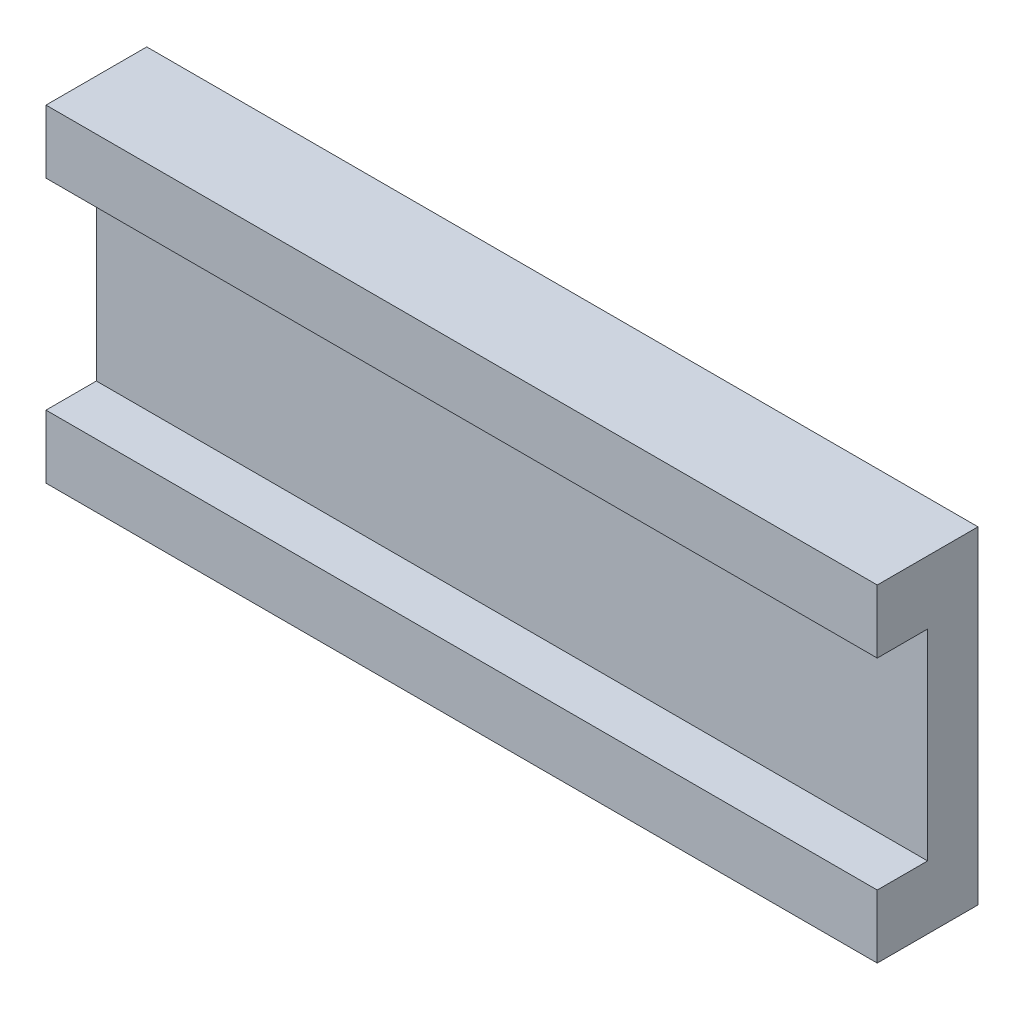
ISO-10303-21;
HEADER;
FILE_DESCRIPTION(('STEP AP214'),'2;1');
FILE_NAME('part.step','',(''),(''),'','','');
FILE_SCHEMA(('AUTOMOTIVE_DESIGN { 1 0 10303 214 1 1 1 1 }'));
ENDSEC;
DATA;
#1=APPLICATION_CONTEXT('core data for automotive mechanical design processes');
#2=APPLICATION_PROTOCOL_DEFINITION('international standard','automotive_design',2000,#1);
#3=PRODUCT_CONTEXT('',#1,'mechanical');
#4=PRODUCT('Part','Part','',(#3));
#5=PRODUCT_RELATED_PRODUCT_CATEGORY('part','',(#4));
#6=PRODUCT_DEFINITION_FORMATION('','',#4);
#7=PRODUCT_DEFINITION_CONTEXT('part definition',#1,'design');
#8=PRODUCT_DEFINITION('design','',#6,#7);
#9=PRODUCT_DEFINITION_SHAPE('','',#8);
#10=(LENGTH_UNIT() NAMED_UNIT(*) SI_UNIT(.MILLI.,.METRE.));
#11=(NAMED_UNIT(*) PLANE_ANGLE_UNIT() SI_UNIT($,.RADIAN.));
#12=(NAMED_UNIT(*) SI_UNIT($,.STERADIAN.) SOLID_ANGLE_UNIT());
#13=UNCERTAINTY_MEASURE_WITH_UNIT(LENGTH_MEASURE(1.E-05),#10,'distance_accuracy_value','');
#14=(GEOMETRIC_REPRESENTATION_CONTEXT(3) GLOBAL_UNCERTAINTY_ASSIGNED_CONTEXT((#13)) GLOBAL_UNIT_ASSIGNED_CONTEXT((#10,
#11,#12)) REPRESENTATION_CONTEXT('',''));
#15=CARTESIAN_POINT('',(0.,0.,0.));
#16=DIRECTION('',(0.,0.,1.));
#17=DIRECTION('',(1.,0.,0.));
#18=AXIS2_PLACEMENT_3D('',#15,#16,#17);
#19=CARTESIAN_POINT('',(0.,0.,5.08));
#20=DIRECTION('',(0.,0.,1.));
#21=DIRECTION('',(1.,0.,0.));
#22=AXIS2_PLACEMENT_3D('',#19,#20,#21);
#23=PLANE('',#22);
#24=DIRECTION('',(0.,-1.,0.));
#25=VECTOR('',#24,1.);
#26=CARTESIAN_POINT('',(-41.91,-16.51,5.08));
#27=LINE('',#26,#25);
#28=CARTESIAN_POINT('',(-41.91,10.1277575121056,5.08));
#29=VERTEX_POINT('',#28);
#30=CARTESIAN_POINT('',(-41.91,-10.1277575121056,5.08));
#31=VERTEX_POINT('',#30);
#32=EDGE_CURVE('E60',#29,#31,#27,.T.);
#33=ORIENTED_EDGE('',*,*,#32,.T.);
#34=DIRECTION('',(-1.,0.,0.));
#35=VECTOR('',#34,1.);
#36=CARTESIAN_POINT('',(41.91,-10.1277575121056,5.08));
#37=LINE('',#36,#35);
#38=CARTESIAN_POINT('',(41.91,-10.1277575121056,5.08));
#39=VERTEX_POINT('',#38);
#40=EDGE_CURVE('E55',#39,#31,#37,.T.);
#41=ORIENTED_EDGE('',*,*,#40,.F.);
#42=DIRECTION('',(0.,1.,0.));
#43=VECTOR('',#42,1.);
#44=CARTESIAN_POINT('',(41.91,-16.51,5.08));
#45=LINE('',#44,#43);
#46=CARTESIAN_POINT('',(41.91,10.1277575121056,5.08));
#47=VERTEX_POINT('',#46);
#48=EDGE_CURVE('E128',#39,#47,#45,.T.);
#49=ORIENTED_EDGE('',*,*,#48,.T.);
#50=DIRECTION('',(1.,0.,0.));
#51=VECTOR('',#50,1.);
#52=CARTESIAN_POINT('',(-41.91,10.1277575121056,5.08));
#53=LINE('',#52,#51);
#54=EDGE_CURVE('E130',#29,#47,#53,.T.);
#55=ORIENTED_EDGE('',*,*,#54,.F.);
#56=EDGE_LOOP('',(#33,#41,#49,#55));
#57=FACE_BOUND('',#56,.T.);
#58=ADVANCED_FACE('F39',(#57),#23,.T.);
#59=CARTESIAN_POINT('',(-41.91,-16.51,5.08));
#60=DIRECTION('',(1.,0.,0.));
#61=DIRECTION('',(0.,0.,-1.));
#62=AXIS2_PLACEMENT_3D('',#59,#60,#61);
#63=PLANE('',#62);
#64=DIRECTION('',(0.,-1.,0.));
#65=VECTOR('',#64,1.);
#66=CARTESIAN_POINT('',(-41.91,-16.51,0.));
#67=LINE('',#66,#65);
#68=CARTESIAN_POINT('',(-41.91,16.51,0.));
#69=VERTEX_POINT('',#68);
#70=CARTESIAN_POINT('',(-41.91,-16.51,0.));
#71=VERTEX_POINT('',#70);
#72=EDGE_CURVE('E161',#69,#71,#67,.T.);
#73=ORIENTED_EDGE('',*,*,#72,.T.);
#74=DIRECTION('',(0.,0.,-1.));
#75=VECTOR('',#74,1.);
#76=CARTESIAN_POINT('',(-41.91,-16.51,5.08));
#77=LINE('',#76,#75);
#78=CARTESIAN_POINT('',(-41.91,-16.51,10.16));
#79=VERTEX_POINT('',#78);
#80=EDGE_CURVE('E11',#79,#71,#77,.T.);
#81=ORIENTED_EDGE('',*,*,#80,.F.);
#82=DIRECTION('',(0.,-1.,0.));
#83=VECTOR('',#82,1.);
#84=CARTESIAN_POINT('',(-41.91,-16.51,10.16));
#85=LINE('',#84,#83);
#86=CARTESIAN_POINT('',(-41.91,-10.1277575121056,10.16));
#87=VERTEX_POINT('',#86);
#88=EDGE_CURVE('E114',#87,#79,#85,.T.);
#89=ORIENTED_EDGE('',*,*,#88,.F.);
#90=DIRECTION('',(0.,0.,-1.));
#91=VECTOR('',#90,1.);
#92=CARTESIAN_POINT('',(-41.91,-10.1277575121056,10.16));
#93=LINE('',#92,#91);
#94=EDGE_CURVE('E109',#87,#31,#93,.T.);
#95=ORIENTED_EDGE('',*,*,#94,.T.);
#96=ORIENTED_EDGE('',*,*,#32,.F.);
#97=DIRECTION('',(0.,0.,-1.));
#98=VECTOR('',#97,1.);
#99=CARTESIAN_POINT('',(-41.91,10.1277575121056,10.16));
#100=LINE('',#99,#98);
#101=CARTESIAN_POINT('',(-41.91,10.1277575121056,10.16));
#102=VERTEX_POINT('',#101);
#103=EDGE_CURVE('E157',#102,#29,#100,.T.);
#104=ORIENTED_EDGE('',*,*,#103,.F.);
#105=DIRECTION('',(0.,-1.,0.));
#106=VECTOR('',#105,1.);
#107=CARTESIAN_POINT('',(-41.91,16.51,10.16));
#108=LINE('',#107,#106);
#109=CARTESIAN_POINT('',(-41.91,16.51,10.16));
#110=VERTEX_POINT('',#109);
#111=EDGE_CURVE('E135',#110,#102,#108,.T.);
#112=ORIENTED_EDGE('',*,*,#111,.F.);
#113=DIRECTION('',(0.,0.,-1.));
#114=VECTOR('',#113,1.);
#115=CARTESIAN_POINT('',(-41.91,16.51,5.08));
#116=LINE('',#115,#114);
#117=EDGE_CURVE('E167',#110,#69,#116,.T.);
#118=ORIENTED_EDGE('',*,*,#117,.T.);
#119=EDGE_LOOP('',(#73,#81,#89,#95,#96,#104,#112,#118));
#120=FACE_BOUND('',#119,.T.);
#121=ADVANCED_FACE('F41',(#120),#63,.F.);
#122=CARTESIAN_POINT('',(41.91,-16.51,5.08));
#123=DIRECTION('',(0.,1.,0.));
#124=DIRECTION('',(0.,0.,1.));
#125=AXIS2_PLACEMENT_3D('',#122,#123,#124);
#126=PLANE('',#125);
#127=DIRECTION('',(1.,0.,0.));
#128=VECTOR('',#127,1.);
#129=CARTESIAN_POINT('',(41.91,-16.51,0.));
#130=LINE('',#129,#128);
#131=CARTESIAN_POINT('',(41.91,-16.51,0.));
#132=VERTEX_POINT('',#131);
#133=EDGE_CURVE('E171',#71,#132,#130,.T.);
#134=ORIENTED_EDGE('',*,*,#133,.T.);
#135=DIRECTION('',(0.,0.,-1.));
#136=VECTOR('',#135,1.);
#137=CARTESIAN_POINT('',(41.91,-16.51,5.08));
#138=LINE('',#137,#136);
#139=CARTESIAN_POINT('',(41.91,-16.51,10.16));
#140=VERTEX_POINT('',#139);
#141=EDGE_CURVE('E48',#140,#132,#138,.T.);
#142=ORIENTED_EDGE('',*,*,#141,.F.);
#143=DIRECTION('',(1.,0.,0.));
#144=VECTOR('',#143,1.);
#145=CARTESIAN_POINT('',(41.91,-16.51,10.16));
#146=LINE('',#145,#144);
#147=EDGE_CURVE('E121',#79,#140,#146,.T.);
#148=ORIENTED_EDGE('',*,*,#147,.F.);
#149=ORIENTED_EDGE('',*,*,#80,.T.);
#150=EDGE_LOOP('',(#134,#142,#148,#149));
#151=FACE_BOUND('',#150,.T.);
#152=ADVANCED_FACE('F209',(#151),#126,.F.);
#153=CARTESIAN_POINT('',(41.91,-16.51,5.08));
#154=DIRECTION('',(-1.,0.,0.));
#155=DIRECTION('',(0.,0.,1.));
#156=AXIS2_PLACEMENT_3D('',#153,#154,#155);
#157=PLANE('',#156);
#158=DIRECTION('',(0.,1.,0.));
#159=VECTOR('',#158,1.);
#160=CARTESIAN_POINT('',(41.91,-16.51,0.));
#161=LINE('',#160,#159);
#162=CARTESIAN_POINT('',(41.91,16.51,0.));
#163=VERTEX_POINT('',#162);
#164=EDGE_CURVE('E174',#132,#163,#161,.T.);
#165=ORIENTED_EDGE('',*,*,#164,.T.);
#166=DIRECTION('',(0.,0.,-1.));
#167=VECTOR('',#166,1.);
#168=CARTESIAN_POINT('',(41.91,16.51,5.08));
#169=LINE('',#168,#167);
#170=CARTESIAN_POINT('',(41.91,16.51,10.16));
#171=VERTEX_POINT('',#170);
#172=EDGE_CURVE('E182',#171,#163,#169,.T.);
#173=ORIENTED_EDGE('',*,*,#172,.F.);
#174=DIRECTION('',(0.,1.,0.));
#175=VECTOR('',#174,1.);
#176=CARTESIAN_POINT('',(41.91,16.51,10.16));
#177=LINE('',#176,#175);
#178=CARTESIAN_POINT('',(41.91,10.1277575121056,10.16));
#179=VERTEX_POINT('',#178);
#180=EDGE_CURVE('E146',#179,#171,#177,.T.);
#181=ORIENTED_EDGE('',*,*,#180,.F.);
#182=DIRECTION('',(0.,0.,-1.));
#183=VECTOR('',#182,1.);
#184=CARTESIAN_POINT('',(41.91,10.1277575121056,10.16));
#185=LINE('',#184,#183);
#186=EDGE_CURVE('E153',#179,#47,#185,.T.);
#187=ORIENTED_EDGE('',*,*,#186,.T.);
#188=ORIENTED_EDGE('',*,*,#48,.F.);
#189=DIRECTION('',(0.,0.,-1.));
#190=VECTOR('',#189,1.);
#191=CARTESIAN_POINT('',(41.91,-10.1277575121056,10.16));
#192=LINE('',#191,#190);
#193=CARTESIAN_POINT('',(41.91,-10.1277575121056,10.16));
#194=VERTEX_POINT('',#193);
#195=EDGE_CURVE('E107',#194,#39,#192,.T.);
#196=ORIENTED_EDGE('',*,*,#195,.F.);
#197=DIRECTION('',(0.,1.,0.));
#198=VECTOR('',#197,1.);
#199=CARTESIAN_POINT('',(41.91,-16.51,10.16));
#200=LINE('',#199,#198);
#201=EDGE_CURVE('E115',#140,#194,#200,.T.);
#202=ORIENTED_EDGE('',*,*,#201,.F.);
#203=ORIENTED_EDGE('',*,*,#141,.T.);
#204=EDGE_LOOP('',(#165,#173,#181,#187,#188,#196,#202,#203));
#205=FACE_BOUND('',#204,.T.);
#206=ADVANCED_FACE('F126',(#205),#157,.F.);
#207=CARTESIAN_POINT('',(41.91,16.51,5.08));
#208=DIRECTION('',(0.,-1.,0.));
#209=DIRECTION('',(1.,0.,0.));
#210=AXIS2_PLACEMENT_3D('',#207,#208,#209);
#211=PLANE('',#210);
#212=DIRECTION('',(-1.,0.,0.));
#213=VECTOR('',#212,1.);
#214=CARTESIAN_POINT('',(41.91,16.51,0.));
#215=LINE('',#214,#213);
#216=EDGE_CURVE('E164',#163,#69,#215,.T.);
#217=ORIENTED_EDGE('',*,*,#216,.T.);
#218=ORIENTED_EDGE('',*,*,#117,.F.);
#219=DIRECTION('',(-1.,0.,0.));
#220=VECTOR('',#219,1.);
#221=CARTESIAN_POINT('',(-41.91,16.51,10.16));
#222=LINE('',#221,#220);
#223=EDGE_CURVE('E150',#171,#110,#222,.T.);
#224=ORIENTED_EDGE('',*,*,#223,.F.);
#225=ORIENTED_EDGE('',*,*,#172,.T.);
#226=EDGE_LOOP('',(#217,#218,#224,#225));
#227=FACE_BOUND('',#226,.T.);
#228=ADVANCED_FACE('F193',(#227),#211,.F.);
#229=CARTESIAN_POINT('',(0.,0.,0.));
#230=DIRECTION('',(0.,0.,1.));
#231=DIRECTION('',(1.,0.,0.));
#232=AXIS2_PLACEMENT_3D('',#229,#230,#231);
#233=PLANE('',#232);
#234=ORIENTED_EDGE('',*,*,#72,.F.);
#235=ORIENTED_EDGE('',*,*,#216,.F.);
#236=ORIENTED_EDGE('',*,*,#164,.F.);
#237=ORIENTED_EDGE('',*,*,#133,.F.);
#238=EDGE_LOOP('',(#234,#235,#236,#237));
#239=FACE_BOUND('',#238,.T.);
#240=ADVANCED_FACE('F191',(#239),#233,.F.);
#241=CARTESIAN_POINT('',(-41.91,10.1277575121056,10.16));
#242=DIRECTION('',(0.,1.,0.));
#243=DIRECTION('',(0.,0.,1.));
#244=AXIS2_PLACEMENT_3D('',#241,#242,#243);
#245=PLANE('',#244);
#246=ORIENTED_EDGE('',*,*,#54,.T.);
#247=ORIENTED_EDGE('',*,*,#186,.F.);
#248=DIRECTION('',(1.,0.,0.));
#249=VECTOR('',#248,1.);
#250=CARTESIAN_POINT('',(-41.91,10.1277575121056,10.16));
#251=LINE('',#250,#249);
#252=EDGE_CURVE('E143',#102,#179,#251,.T.);
#253=ORIENTED_EDGE('',*,*,#252,.F.);
#254=ORIENTED_EDGE('',*,*,#103,.T.);
#255=EDGE_LOOP('',(#246,#247,#253,#254));
#256=FACE_BOUND('',#255,.T.);
#257=ADVANCED_FACE('F203',(#256),#245,.F.);
#258=CARTESIAN_POINT('',(0.,0.,10.16));
#259=DIRECTION('',(0.,0.,1.));
#260=DIRECTION('',(1.,0.,0.));
#261=AXIS2_PLACEMENT_3D('',#258,#259,#260);
#262=PLANE('',#261);
#263=ORIENTED_EDGE('',*,*,#111,.T.);
#264=ORIENTED_EDGE('',*,*,#252,.T.);
#265=ORIENTED_EDGE('',*,*,#180,.T.);
#266=ORIENTED_EDGE('',*,*,#223,.T.);
#267=EDGE_LOOP('',(#263,#264,#265,#266));
#268=FACE_BOUND('',#267,.T.);
#269=ADVANCED_FACE('F199',(#268),#262,.T.);
#270=CARTESIAN_POINT('',(41.91,-10.1277575121056,10.16));
#271=DIRECTION('',(0.,-1.,0.));
#272=DIRECTION('',(1.,0.,0.));
#273=AXIS2_PLACEMENT_3D('',#270,#271,#272);
#274=PLANE('',#273);
#275=ORIENTED_EDGE('',*,*,#40,.T.);
#276=ORIENTED_EDGE('',*,*,#94,.F.);
#277=DIRECTION('',(-1.,0.,0.));
#278=VECTOR('',#277,1.);
#279=CARTESIAN_POINT('',(41.91,-10.1277575121056,10.16));
#280=LINE('',#279,#278);
#281=EDGE_CURVE('E103',#194,#87,#280,.T.);
#282=ORIENTED_EDGE('',*,*,#281,.F.);
#283=ORIENTED_EDGE('',*,*,#195,.T.);
#284=EDGE_LOOP('',(#275,#276,#282,#283));
#285=FACE_BOUND('',#284,.T.);
#286=ADVANCED_FACE('F105',(#285),#274,.F.);
#287=CARTESIAN_POINT('',(0.,0.,10.16));
#288=DIRECTION('',(0.,0.,1.));
#289=DIRECTION('',(1.,0.,0.));
#290=AXIS2_PLACEMENT_3D('',#287,#288,#289);
#291=PLANE('',#290);
#292=ORIENTED_EDGE('',*,*,#201,.T.);
#293=ORIENTED_EDGE('',*,*,#281,.T.);
#294=ORIENTED_EDGE('',*,*,#88,.T.);
#295=ORIENTED_EDGE('',*,*,#147,.T.);
#296=EDGE_LOOP('',(#292,#293,#294,#295));
#297=FACE_BOUND('',#296,.T.);
#298=ADVANCED_FACE('F119',(#297),#291,.T.);
#299=CLOSED_SHELL('',(#58,#121,#152,#206,#228,#240,#257,#269,#286,#298));
#300=MANIFOLD_SOLID_BREP('B2',#299);
#301=ADVANCED_BREP_SHAPE_REPRESENTATION('',(#18,#300),#14);
#302=SHAPE_DEFINITION_REPRESENTATION(#9,#301);
ENDSEC;
END-ISO-10303-21;
